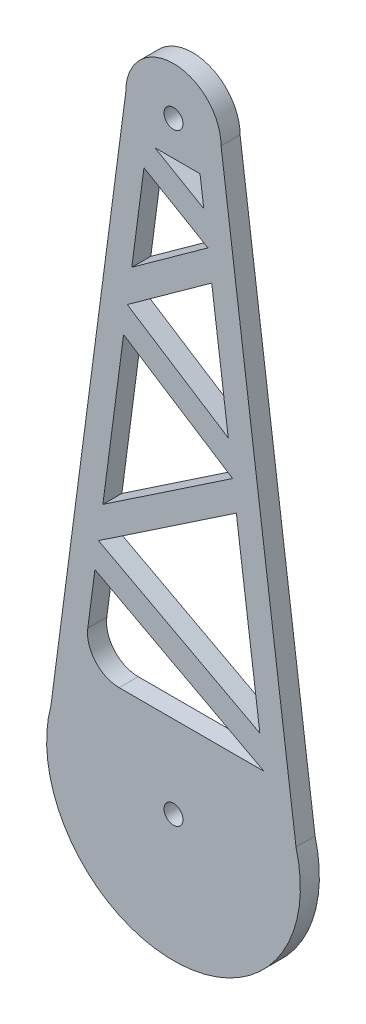
ISO-10303-21;
HEADER;
FILE_DESCRIPTION(('STEP AP214'),'2;1');
FILE_NAME('part.step','',(''),(''),'','','');
FILE_SCHEMA(('AUTOMOTIVE_DESIGN { 1 0 10303 214 1 1 1 1 }'));
ENDSEC;
DATA;
#1=APPLICATION_CONTEXT('core data for automotive mechanical design processes');
#2=APPLICATION_PROTOCOL_DEFINITION('international standard','automotive_design',2000,#1);
#3=PRODUCT_CONTEXT('',#1,'mechanical');
#4=PRODUCT('Part','Part','',(#3));
#5=PRODUCT_RELATED_PRODUCT_CATEGORY('part','',(#4));
#6=PRODUCT_DEFINITION_FORMATION('','',#4);
#7=PRODUCT_DEFINITION_CONTEXT('part definition',#1,'design');
#8=PRODUCT_DEFINITION('design','',#6,#7);
#9=PRODUCT_DEFINITION_SHAPE('','',#8);
#10=(LENGTH_UNIT() NAMED_UNIT(*) SI_UNIT(.MILLI.,.METRE.));
#11=(NAMED_UNIT(*) PLANE_ANGLE_UNIT() SI_UNIT($,.RADIAN.));
#12=(NAMED_UNIT(*) SI_UNIT($,.STERADIAN.) SOLID_ANGLE_UNIT());
#13=UNCERTAINTY_MEASURE_WITH_UNIT(LENGTH_MEASURE(1.E-05),#10,'distance_accuracy_value','');
#14=(GEOMETRIC_REPRESENTATION_CONTEXT(3) GLOBAL_UNCERTAINTY_ASSIGNED_CONTEXT((#13)) GLOBAL_UNIT_ASSIGNED_CONTEXT((#10,
#11,#12)) REPRESENTATION_CONTEXT('',''));
#15=CARTESIAN_POINT('',(0.,0.,0.));
#16=DIRECTION('',(0.,0.,1.));
#17=DIRECTION('',(1.,0.,0.));
#18=AXIS2_PLACEMENT_3D('',#15,#16,#17);
#19=CARTESIAN_POINT('',(0.,0.,3.));
#20=DIRECTION('',(0.,0.,1.));
#21=DIRECTION('',(1.,0.,0.));
#22=AXIS2_PLACEMENT_3D('',#19,#20,#21);
#23=PLANE('',#22);
#24=CARTESIAN_POINT('',(0.,95.,3.));
#25=DIRECTION('',(0.,0.,1.));
#26=DIRECTION('',(1.,0.,0.));
#27=AXIS2_PLACEMENT_3D('',#24,#25,#26);
#28=CIRCLE('',#27,1.5);
#29=CARTESIAN_POINT('',(1.5,95.,3.));
#30=VERTEX_POINT('',#29);
#31=EDGE_CURVE('E346',#30,#30,#28,.T.);
#32=ORIENTED_EDGE('',*,*,#31,.F.);
#33=EDGE_LOOP('',(#32));
#34=FACE_BOUND('',#33,.T.);
#35=CARTESIAN_POINT('',(0.,0.,3.));
#36=DIRECTION('',(0.,0.,1.));
#37=DIRECTION('',(1.,0.,0.));
#38=AXIS2_PLACEMENT_3D('',#35,#36,#37);
#39=CIRCLE('',#38,20.);
#40=CARTESIAN_POINT('',(-19.3192648059905,5.17358747447242,3.));
#41=VERTEX_POINT('',#40);
#42=CARTESIAN_POINT('',(19.3192648059905,5.17358747447242,3.));
#43=VERTEX_POINT('',#42);
#44=EDGE_CURVE('E352',#41,#43,#39,.T.);
#45=ORIENTED_EDGE('',*,*,#44,.T.);
#46=DIRECTION('',(-0.130454512571387,0.991454295542544,0.));
#47=VECTOR('',#46,1.);
#48=CARTESIAN_POINT('',(19.3192648059905,5.17358747447242,3.));
#49=LINE('',#48,#47);
#50=CARTESIAN_POINT('',(7.5,95.,3.));
#51=VERTEX_POINT('',#50);
#52=EDGE_CURVE('E355',#43,#51,#49,.T.);
#53=ORIENTED_EDGE('',*,*,#52,.T.);
#54=CARTESIAN_POINT('',(0.,95.,3.));
#55=DIRECTION('',(0.,0.,1.));
#56=DIRECTION('',(1.,0.,0.));
#57=AXIS2_PLACEMENT_3D('',#54,#55,#56);
#58=CIRCLE('',#57,7.5);
#59=CARTESIAN_POINT('',(-7.5,95.,3.));
#60=VERTEX_POINT('',#59);
#61=EDGE_CURVE('E358',#51,#60,#58,.T.);
#62=ORIENTED_EDGE('',*,*,#61,.T.);
#63=DIRECTION('',(-0.130454512571387,-0.991454295542544,0.));
#64=VECTOR('',#63,1.);
#65=CARTESIAN_POINT('',(-19.3192648059905,5.17358747447242,3.));
#66=LINE('',#65,#64);
#67=EDGE_CURVE('E360',#60,#41,#66,.T.);
#68=ORIENTED_EDGE('',*,*,#67,.T.);
#69=EDGE_LOOP('',(#45,#53,#62,#68));
#70=FACE_BOUND('',#69,.T.);
#71=CARTESIAN_POINT('',(0.,0.,3.));
#72=DIRECTION('',(0.,0.,1.));
#73=DIRECTION('',(1.,0.,0.));
#74=AXIS2_PLACEMENT_3D('',#71,#72,#73);
#75=CIRCLE('',#74,1.5);
#76=CARTESIAN_POINT('',(1.5,0.,3.));
#77=VERTEX_POINT('',#76);
#78=EDGE_CURVE('E340',#77,#77,#75,.T.);
#79=ORIENTED_EDGE('',*,*,#78,.F.);
#80=EDGE_LOOP('',(#79));
#81=FACE_BOUND('',#80,.T.);
#82=DIRECTION('',(1.,0.,0.));
#83=VECTOR('',#82,1.);
#84=CARTESIAN_POINT('',(-14.2549962322659,13.,3.));
#85=LINE('',#84,#83);
#86=CARTESIAN_POINT('',(-8.55400468049309,13.,3.));
#87=VERTEX_POINT('',#86);
#88=CARTESIAN_POINT('',(14.2549962322659,13.,3.));
#89=VERTEX_POINT('',#88);
#90=EDGE_CURVE('E323',#87,#89,#85,.T.);
#91=ORIENTED_EDGE('',*,*,#90,.F.);
#92=CARTESIAN_POINT('',(-8.55400468049309,18.,3.));
#93=DIRECTION('',(0.,0.,1.));
#94=DIRECTION('',(1.,0.,0.));
#95=AXIS2_PLACEMENT_3D('',#92,#93,#94);
#96=CIRCLE('',#95,5.);
#97=CARTESIAN_POINT('',(-13.5112761582058,18.6522725628569,3.));
#98=VERTEX_POINT('',#97);
#99=EDGE_CURVE('E11',#87,#98,#96,.F.);
#100=ORIENTED_EDGE('',*,*,#99,.T.);
#101=DIRECTION('',(-0.130454512571387,-0.991454295542544,0.));
#102=VECTOR('',#101,1.);
#103=CARTESIAN_POINT('',(-14.2549962322659,13.,3.));
#104=LINE('',#103,#102);
#105=CARTESIAN_POINT('',(-12.3855612897754,27.2077055629279,3.));
#106=VERTEX_POINT('',#105);
#107=EDGE_CURVE('E320',#106,#98,#104,.T.);
#108=ORIENTED_EDGE('',*,*,#107,.F.);
#109=DIRECTION('',(-0.882361079618329,0.470572975397842,0.));
#110=VECTOR('',#109,1.);
#111=CARTESIAN_POINT('',(-12.3855612897754,27.2077055629279,3.));
#112=LINE('',#111,#110);
#113=EDGE_CURVE('E326',#89,#106,#112,.T.);
#114=ORIENTED_EDGE('',*,*,#113,.F.);
#115=EDGE_LOOP('',(#91,#100,#108,#114));
#116=FACE_BOUND('',#115,.T.);
#117=DIRECTION('',(-1.,0.,0.));
#118=VECTOR('',#117,1.);
#119=CARTESIAN_POINT('',(-2.8983293994928,89.5344183994068,3.));
#120=LINE('',#119,#118);
#121=CARTESIAN_POINT('',(4.18467802181767,89.5344183994068,3.));
#122=VERTEX_POINT('',#121);
#123=CARTESIAN_POINT('',(-2.8983293994928,89.5344183994068,3.));
#124=VERTEX_POINT('',#123);
#125=EDGE_CURVE('E298',#122,#124,#120,.T.);
#126=ORIENTED_EDGE('',*,*,#125,.F.);
#127=DIRECTION('',(-0.130454512571387,0.991454295542544,0.));
#128=VECTOR('',#127,1.);
#129=CARTESIAN_POINT('',(4.18467802181767,89.5344183994068,3.));
#130=LINE('',#129,#128);
#131=CARTESIAN_POINT('',(4.77424214587069,85.0537310566038,3.));
#132=VERTEX_POINT('',#131);
#133=EDGE_CURVE('E296',#132,#122,#130,.T.);
#134=ORIENTED_EDGE('',*,*,#133,.F.);
#135=DIRECTION('',(0.863532865345183,-0.504292564359953,0.));
#136=VECTOR('',#135,1.);
#137=CARTESIAN_POINT('',(4.77424214587069,85.0537310566038,3.));
#138=LINE('',#137,#136);
#139=EDGE_CURVE('E302',#124,#132,#138,.T.);
#140=ORIENTED_EDGE('',*,*,#139,.F.);
#141=EDGE_LOOP('',(#126,#134,#140));
#142=FACE_BOUND('',#141,.T.);
#143=DIRECTION('',(0.882361079618329,-0.470572975397842,0.));
#144=VECTOR('',#143,1.);
#145=CARTESIAN_POINT('',(-11.8281878592665,31.4437436347958,3.));
#146=LINE('',#145,#144);
#147=CARTESIAN_POINT('',(-11.8281878592665,31.4437436347958,3.));
#148=VERTEX_POINT('',#147);
#149=CARTESIAN_POINT('',(13.6134947317704,17.8754114037659,3.));
#150=VERTEX_POINT('',#149);
#151=EDGE_CURVE('E274',#148,#150,#146,.T.);
#152=ORIENTED_EDGE('',*,*,#151,.F.);
#153=DIRECTION('',(-0.829674359833625,-0.558247666036021,0.));
#154=VECTOR('',#153,1.);
#155=CARTESIAN_POINT('',(-11.8281878592665,31.4437436347958,3.));
#156=LINE('',#155,#154);
#157=CARTESIAN_POINT('',(9.90415614739839,46.0663846449933,3.));
#158=VERTEX_POINT('',#157);
#159=EDGE_CURVE('E272',#158,#148,#156,.T.);
#160=ORIENTED_EDGE('',*,*,#159,.F.);
#161=DIRECTION('',(-0.130454512571388,0.991454295542544,0.));
#162=VECTOR('',#161,1.);
#163=CARTESIAN_POINT('',(9.90415614739839,46.0663846449933,3.));
#164=LINE('',#163,#162);
#165=EDGE_CURVE('E278',#150,#158,#164,.T.);
#166=ORIENTED_EDGE('',*,*,#165,.F.);
#167=EDGE_LOOP('',(#152,#160,#166));
#168=FACE_BOUND('',#167,.T.);
#169=DIRECTION('',(-0.841016420524364,0.541009593638029,0.));
#170=VECTOR('',#169,1.);
#171=CARTESIAN_POINT('',(9.32138627489469,50.4954356760215,3.));
#172=LINE('',#171,#170);
#173=CARTESIAN_POINT('',(9.32138627489469,50.4954356760215,3.));
#174=VERTEX_POINT('',#173);
#175=CARTESIAN_POINT('',(-7.86656077104383,61.552109505288,3.));
#176=VERTEX_POINT('',#175);
#177=EDGE_CURVE('E250',#174,#176,#172,.T.);
#178=ORIENTED_EDGE('',*,*,#177,.F.);
#179=DIRECTION('',(0.829674359833625,0.558247666036021,0.));
#180=VECTOR('',#179,1.);
#181=CARTESIAN_POINT('',(-11.1322061493552,36.7332046301214,3.));
#182=LINE('',#181,#180);
#183=CARTESIAN_POINT('',(-11.1322061493552,36.7332046301214,3.));
#184=VERTEX_POINT('',#183);
#185=EDGE_CURVE('E248',#184,#174,#182,.T.);
#186=ORIENTED_EDGE('',*,*,#185,.F.);
#187=DIRECTION('',(-0.130454512571387,-0.991454295542544,0.));
#188=VECTOR('',#187,1.);
#189=CARTESIAN_POINT('',(-11.1322061493552,36.7332046301214,3.));
#190=LINE('',#189,#188);
#191=EDGE_CURVE('E254',#176,#184,#190,.T.);
#192=ORIENTED_EDGE('',*,*,#191,.F.);
#193=EDGE_LOOP('',(#178,#186,#192));
#194=FACE_BOUND('',#193,.T.);
#195=DIRECTION('',(0.841016420524364,-0.54100959363803,0.));
#196=VECTOR('',#195,1.);
#197=CARTESIAN_POINT('',(-7.2895878516735,65.9371036925025,3.));
#198=LINE('',#197,#196);
#199=CARTESIAN_POINT('',(-7.2895878516735,65.9371036925025,3.));
#200=VERTEX_POINT('',#199);
#201=CARTESIAN_POINT('',(8.63770917531629,55.6913816328174,3.));
#202=VERTEX_POINT('',#201);
#203=EDGE_CURVE('E226',#200,#202,#198,.T.);
#204=ORIENTED_EDGE('',*,*,#203,.F.);
#205=DIRECTION('',(-0.811312634400087,-0.584612529170211,0.));
#206=VECTOR('',#205,1.);
#207=CARTESIAN_POINT('',(-7.2895878516735,65.9371036925025,3.));
#208=LINE('',#207,#206);
#209=CARTESIAN_POINT('',(6.02700626826781,75.5327237263858,3.));
#210=VERTEX_POINT('',#209);
#211=EDGE_CURVE('E224',#210,#200,#208,.T.);
#212=ORIENTED_EDGE('',*,*,#211,.F.);
#213=DIRECTION('',(-0.130454512571388,0.991454295542544,0.));
#214=VECTOR('',#213,1.);
#215=CARTESIAN_POINT('',(6.02700626826781,75.5327237263858,3.));
#216=LINE('',#215,#214);
#217=EDGE_CURVE('E230',#202,#210,#216,.T.);
#218=ORIENTED_EDGE('',*,*,#217,.F.);
#219=EDGE_LOOP('',(#204,#212,#218));
#220=FACE_BOUND('',#219,.T.);
#221=DIRECTION('',(0.811312634400087,0.584612529170212,0.));
#222=VECTOR('',#221,1.);
#223=CARTESIAN_POINT('',(-6.57291709451182,71.3838014469313,3.));
#224=LINE('',#223,#222);
#225=CARTESIAN_POINT('',(-6.57291709451182,71.3838014469313,3.));
#226=VERTEX_POINT('',#225);
#227=CARTESIAN_POINT('',(5.43446534090851,80.0360347743164,3.));
#228=VERTEX_POINT('',#227);
#229=EDGE_CURVE('E202',#226,#228,#224,.T.);
#230=ORIENTED_EDGE('',*,*,#229,.F.);
#231=DIRECTION('',(-0.130454512571387,-0.991454295542544,0.));
#232=VECTOR('',#231,1.);
#233=CARTESIAN_POINT('',(-6.57291709451182,71.3838014469313,3.));
#234=LINE('',#233,#232);
#235=CARTESIAN_POINT('',(-4.65888722730547,85.9304284376996,3.));
#236=VERTEX_POINT('',#235);
#237=EDGE_CURVE('E192',#236,#226,#234,.T.);
#238=ORIENTED_EDGE('',*,*,#237,.F.);
#239=DIRECTION('',(-0.863532865345184,0.504292564359953,0.));
#240=VECTOR('',#239,1.);
#241=CARTESIAN_POINT('',(5.43446534090851,80.0360347743164,3.));
#242=LINE('',#241,#240);
#243=EDGE_CURVE('E213',#228,#236,#242,.T.);
#244=ORIENTED_EDGE('',*,*,#243,.F.);
#245=EDGE_LOOP('',(#230,#238,#244));
#246=FACE_BOUND('',#245,.T.);
#247=ADVANCED_FACE('F38',(#34,#70,#81,#116,#142,#168,#194,#220,#246),#23,.T.);
#248=CARTESIAN_POINT('',(0.,0.,0.));
#249=DIRECTION('',(0.,0.,1.));
#250=DIRECTION('',(1.,0.,0.));
#251=AXIS2_PLACEMENT_3D('',#248,#249,#250);
#252=PLANE('',#251);
#253=DIRECTION('',(-0.811312634400087,-0.584612529170211,0.));
#254=VECTOR('',#253,1.);
#255=CARTESIAN_POINT('',(-7.2895878516735,65.9371036925025,0.));
#256=LINE('',#255,#254);
#257=CARTESIAN_POINT('',(6.02700626826781,75.5327237263858,0.));
#258=VERTEX_POINT('',#257);
#259=CARTESIAN_POINT('',(-7.2895878516735,65.9371036925025,0.));
#260=VERTEX_POINT('',#259);
#261=EDGE_CURVE('E210',#258,#260,#256,.T.);
#262=ORIENTED_EDGE('',*,*,#261,.T.);
#263=DIRECTION('',(0.841016420524364,-0.54100959363803,0.));
#264=VECTOR('',#263,1.);
#265=CARTESIAN_POINT('',(-7.2895878516735,65.9371036925025,0.));
#266=LINE('',#265,#264);
#267=CARTESIAN_POINT('',(8.63770917531629,55.6913816328174,0.));
#268=VERTEX_POINT('',#267);
#269=EDGE_CURVE('E235',#260,#268,#266,.T.);
#270=ORIENTED_EDGE('',*,*,#269,.T.);
#271=DIRECTION('',(-0.130454512571388,0.991454295542544,0.));
#272=VECTOR('',#271,1.);
#273=CARTESIAN_POINT('',(6.02700626826781,75.5327237263858,0.));
#274=LINE('',#273,#272);
#275=EDGE_CURVE('E227',#268,#258,#274,.T.);
#276=ORIENTED_EDGE('',*,*,#275,.T.);
#277=EDGE_LOOP('',(#262,#270,#276));
#278=FACE_BOUND('',#277,.T.);
#279=DIRECTION('',(-0.829674359833625,-0.558247666036021,0.));
#280=VECTOR('',#279,1.);
#281=CARTESIAN_POINT('',(-11.8281878592665,31.4437436347958,0.));
#282=LINE('',#281,#280);
#283=CARTESIAN_POINT('',(9.90415614739839,46.0663846449933,0.));
#284=VERTEX_POINT('',#283);
#285=CARTESIAN_POINT('',(-11.8281878592665,31.4437436347958,0.));
#286=VERTEX_POINT('',#285);
#287=EDGE_CURVE('E271',#284,#286,#282,.T.);
#288=ORIENTED_EDGE('',*,*,#287,.T.);
#289=DIRECTION('',(0.882361079618329,-0.470572975397842,0.));
#290=VECTOR('',#289,1.);
#291=CARTESIAN_POINT('',(-11.8281878592665,31.4437436347958,0.));
#292=LINE('',#291,#290);
#293=CARTESIAN_POINT('',(13.6134947317704,17.8754114037659,0.));
#294=VERTEX_POINT('',#293);
#295=EDGE_CURVE('E283',#286,#294,#292,.T.);
#296=ORIENTED_EDGE('',*,*,#295,.T.);
#297=DIRECTION('',(-0.130454512571388,0.991454295542544,0.));
#298=VECTOR('',#297,1.);
#299=CARTESIAN_POINT('',(9.90415614739839,46.0663846449933,0.));
#300=LINE('',#299,#298);
#301=EDGE_CURVE('E275',#294,#284,#300,.T.);
#302=ORIENTED_EDGE('',*,*,#301,.T.);
#303=EDGE_LOOP('',(#288,#296,#302));
#304=FACE_BOUND('',#303,.T.);
#305=DIRECTION('',(-0.130454512571387,-0.991454295542544,0.));
#306=VECTOR('',#305,1.);
#307=CARTESIAN_POINT('',(-14.2549962322659,13.,0.));
#308=LINE('',#307,#306);
#309=CARTESIAN_POINT('',(-12.3855612897754,27.2077055629279,0.));
#310=VERTEX_POINT('',#309);
#311=CARTESIAN_POINT('',(-13.5112761582058,18.6522725628569,0.));
#312=VERTEX_POINT('',#311);
#313=EDGE_CURVE('E319',#310,#312,#308,.T.);
#314=ORIENTED_EDGE('',*,*,#313,.T.);
#315=CARTESIAN_POINT('',(-8.55400468049309,18.,0.));
#316=DIRECTION('',(0.,0.,1.));
#317=DIRECTION('',(1.,0.,0.));
#318=AXIS2_PLACEMENT_3D('',#315,#316,#317);
#319=CIRCLE('',#318,5.);
#320=CARTESIAN_POINT('',(-8.55400468049309,13.,0.));
#321=VERTEX_POINT('',#320);
#322=EDGE_CURVE('E46',#312,#321,#319,.T.);
#323=ORIENTED_EDGE('',*,*,#322,.T.);
#324=DIRECTION('',(1.,0.,0.));
#325=VECTOR('',#324,1.);
#326=CARTESIAN_POINT('',(-14.2549962322659,13.,0.));
#327=LINE('',#326,#325);
#328=CARTESIAN_POINT('',(14.2549962322659,13.,0.));
#329=VERTEX_POINT('',#328);
#330=EDGE_CURVE('E330',#321,#329,#327,.T.);
#331=ORIENTED_EDGE('',*,*,#330,.T.);
#332=DIRECTION('',(-0.882361079618329,0.470572975397842,0.));
#333=VECTOR('',#332,1.);
#334=CARTESIAN_POINT('',(-12.3855612897754,27.2077055629279,0.));
#335=LINE('',#334,#333);
#336=EDGE_CURVE('E324',#329,#310,#335,.T.);
#337=ORIENTED_EDGE('',*,*,#336,.T.);
#338=EDGE_LOOP('',(#314,#323,#331,#337));
#339=FACE_BOUND('',#338,.T.);
#340=CARTESIAN_POINT('',(0.,0.,0.));
#341=DIRECTION('',(0.,0.,1.));
#342=DIRECTION('',(1.,0.,0.));
#343=AXIS2_PLACEMENT_3D('',#340,#341,#342);
#344=CIRCLE('',#343,20.);
#345=CARTESIAN_POINT('',(-19.3192648059905,5.17358747447242,0.));
#346=VERTEX_POINT('',#345);
#347=CARTESIAN_POINT('',(19.3192648059905,5.17358747447242,0.));
#348=VERTEX_POINT('',#347);
#349=EDGE_CURVE('E349',#346,#348,#344,.T.);
#350=ORIENTED_EDGE('',*,*,#349,.F.);
#351=DIRECTION('',(-0.130454512571387,-0.991454295542544,0.));
#352=VECTOR('',#351,1.);
#353=CARTESIAN_POINT('',(-19.3192648059905,5.17358747447242,0.));
#354=LINE('',#353,#352);
#355=CARTESIAN_POINT('',(-7.5,95.,0.));
#356=VERTEX_POINT('',#355);
#357=EDGE_CURVE('E356',#356,#346,#354,.T.);
#358=ORIENTED_EDGE('',*,*,#357,.F.);
#359=CARTESIAN_POINT('',(0.,95.,0.));
#360=DIRECTION('',(0.,0.,1.));
#361=DIRECTION('',(1.,0.,0.));
#362=AXIS2_PLACEMENT_3D('',#359,#360,#361);
#363=CIRCLE('',#362,7.5);
#364=CARTESIAN_POINT('',(7.5,95.,0.));
#365=VERTEX_POINT('',#364);
#366=EDGE_CURVE('E367',#365,#356,#363,.T.);
#367=ORIENTED_EDGE('',*,*,#366,.F.);
#368=DIRECTION('',(-0.130454512571387,0.991454295542544,0.));
#369=VECTOR('',#368,1.);
#370=CARTESIAN_POINT('',(19.3192648059905,5.17358747447242,0.));
#371=LINE('',#370,#369);
#372=EDGE_CURVE('E365',#348,#365,#371,.T.);
#373=ORIENTED_EDGE('',*,*,#372,.F.);
#374=EDGE_LOOP('',(#350,#358,#367,#373));
#375=FACE_BOUND('',#374,.T.);
#376=CARTESIAN_POINT('',(0.,95.,0.));
#377=DIRECTION('',(0.,0.,1.));
#378=DIRECTION('',(1.,0.,0.));
#379=AXIS2_PLACEMENT_3D('',#376,#377,#378);
#380=CIRCLE('',#379,1.5);
#381=CARTESIAN_POINT('',(1.5,95.,0.));
#382=VERTEX_POINT('',#381);
#383=EDGE_CURVE('E343',#382,#382,#380,.T.);
#384=ORIENTED_EDGE('',*,*,#383,.T.);
#385=EDGE_LOOP('',(#384));
#386=FACE_BOUND('',#385,.T.);
#387=CARTESIAN_POINT('',(0.,0.,0.));
#388=DIRECTION('',(0.,0.,1.));
#389=DIRECTION('',(1.,0.,0.));
#390=AXIS2_PLACEMENT_3D('',#387,#388,#389);
#391=CIRCLE('',#390,1.5);
#392=CARTESIAN_POINT('',(1.5,0.,0.));
#393=VERTEX_POINT('',#392);
#394=EDGE_CURVE('E339',#393,#393,#391,.T.);
#395=ORIENTED_EDGE('',*,*,#394,.T.);
#396=EDGE_LOOP('',(#395));
#397=FACE_BOUND('',#396,.T.);
#398=DIRECTION('',(-0.130454512571387,0.991454295542544,0.));
#399=VECTOR('',#398,1.);
#400=CARTESIAN_POINT('',(4.18467802181767,89.5344183994068,0.));
#401=LINE('',#400,#399);
#402=CARTESIAN_POINT('',(4.77424214587069,85.0537310566039,0.));
#403=VERTEX_POINT('',#402);
#404=CARTESIAN_POINT('',(4.18467802181767,89.5344183994068,0.));
#405=VERTEX_POINT('',#404);
#406=EDGE_CURVE('E295',#403,#405,#401,.T.);
#407=ORIENTED_EDGE('',*,*,#406,.T.);
#408=DIRECTION('',(-1.,0.,0.));
#409=VECTOR('',#408,1.);
#410=CARTESIAN_POINT('',(-2.8983293994928,89.5344183994068,0.));
#411=LINE('',#410,#409);
#412=CARTESIAN_POINT('',(-2.8983293994928,89.5344183994068,0.));
#413=VERTEX_POINT('',#412);
#414=EDGE_CURVE('E307',#405,#413,#411,.T.);
#415=ORIENTED_EDGE('',*,*,#414,.T.);
#416=DIRECTION('',(0.863532865345183,-0.504292564359953,0.));
#417=VECTOR('',#416,1.);
#418=CARTESIAN_POINT('',(4.77424214587069,85.0537310566038,0.));
#419=LINE('',#418,#417);
#420=EDGE_CURVE('E299',#413,#403,#419,.T.);
#421=ORIENTED_EDGE('',*,*,#420,.T.);
#422=EDGE_LOOP('',(#407,#415,#421));
#423=FACE_BOUND('',#422,.T.);
#424=DIRECTION('',(0.829674359833625,0.558247666036021,0.));
#425=VECTOR('',#424,1.);
#426=CARTESIAN_POINT('',(-11.1322061493552,36.7332046301214,0.));
#427=LINE('',#426,#425);
#428=CARTESIAN_POINT('',(-11.1322061493552,36.7332046301214,0.));
#429=VERTEX_POINT('',#428);
#430=CARTESIAN_POINT('',(9.32138627489469,50.4954356760215,0.));
#431=VERTEX_POINT('',#430);
#432=EDGE_CURVE('E247',#429,#431,#427,.T.);
#433=ORIENTED_EDGE('',*,*,#432,.T.);
#434=DIRECTION('',(-0.841016420524364,0.541009593638029,0.));
#435=VECTOR('',#434,1.);
#436=CARTESIAN_POINT('',(9.32138627489469,50.4954356760215,0.));
#437=LINE('',#436,#435);
#438=CARTESIAN_POINT('',(-7.86656077104383,61.552109505288,0.));
#439=VERTEX_POINT('',#438);
#440=EDGE_CURVE('E259',#431,#439,#437,.T.);
#441=ORIENTED_EDGE('',*,*,#440,.T.);
#442=DIRECTION('',(-0.130454512571387,-0.991454295542544,0.));
#443=VECTOR('',#442,1.);
#444=CARTESIAN_POINT('',(-11.1322061493552,36.7332046301214,0.));
#445=LINE('',#444,#443);
#446=EDGE_CURVE('E251',#439,#429,#445,.T.);
#447=ORIENTED_EDGE('',*,*,#446,.T.);
#448=EDGE_LOOP('',(#433,#441,#447));
#449=FACE_BOUND('',#448,.T.);
#450=DIRECTION('',(-0.130454512571387,-0.991454295542544,0.));
#451=VECTOR('',#450,1.);
#452=CARTESIAN_POINT('',(-6.57291709451182,71.3838014469313,0.));
#453=LINE('',#452,#451);
#454=CARTESIAN_POINT('',(-4.65888722730547,85.9304284376995,0.));
#455=VERTEX_POINT('',#454);
#456=CARTESIAN_POINT('',(-6.57291709451182,71.3838014469313,0.));
#457=VERTEX_POINT('',#456);
#458=EDGE_CURVE('E217',#455,#457,#453,.T.);
#459=ORIENTED_EDGE('',*,*,#458,.T.);
#460=DIRECTION('',(0.811312634400087,0.584612529170212,0.));
#461=VECTOR('',#460,1.);
#462=CARTESIAN_POINT('',(-6.57291709451182,71.3838014469313,0.));
#463=LINE('',#462,#461);
#464=CARTESIAN_POINT('',(5.43446534090851,80.0360347743164,0.));
#465=VERTEX_POINT('',#464);
#466=EDGE_CURVE('E209',#457,#465,#463,.T.);
#467=ORIENTED_EDGE('',*,*,#466,.T.);
#468=DIRECTION('',(-0.863532865345184,0.504292564359953,0.));
#469=VECTOR('',#468,1.);
#470=CARTESIAN_POINT('',(5.43446534090851,80.0360347743164,0.));
#471=LINE('',#470,#469);
#472=EDGE_CURVE('E203',#465,#455,#471,.T.);
#473=ORIENTED_EDGE('',*,*,#472,.T.);
#474=EDGE_LOOP('',(#459,#467,#473));
#475=FACE_BOUND('',#474,.T.);
#476=ADVANCED_FACE('F391',(#278,#304,#339,#375,#386,#397,#423,#449,#475),#252,.F.);
#477=CARTESIAN_POINT('',(0.,0.,3.));
#478=DIRECTION('',(0.,0.,-1.));
#479=DIRECTION('',(-1.,0.,0.));
#480=AXIS2_PLACEMENT_3D('',#477,#478,#479);
#481=CYLINDRICAL_SURFACE('',#480,20.);
#482=ORIENTED_EDGE('',*,*,#349,.T.);
#483=DIRECTION('',(0.,0.,-1.));
#484=VECTOR('',#483,1.);
#485=CARTESIAN_POINT('',(19.3192648059905,5.17358747447242,3.));
#486=LINE('',#485,#484);
#487=EDGE_CURVE('E378',#43,#348,#486,.T.);
#488=ORIENTED_EDGE('',*,*,#487,.F.);
#489=ORIENTED_EDGE('',*,*,#44,.F.);
#490=DIRECTION('',(0.,0.,-1.));
#491=VECTOR('',#490,1.);
#492=CARTESIAN_POINT('',(-19.3192648059905,5.17358747447242,3.));
#493=LINE('',#492,#491);
#494=EDGE_CURVE('E362',#41,#346,#493,.T.);
#495=ORIENTED_EDGE('',*,*,#494,.T.);
#496=EDGE_LOOP('',(#482,#488,#489,#495));
#497=FACE_BOUND('',#496,.T.);
#498=ADVANCED_FACE('F414',(#497),#481,.T.);
#499=CARTESIAN_POINT('',(19.3192648059905,5.17358747447242,3.));
#500=DIRECTION('',(-0.991454295542544,-0.130454512571387,0.));
#501=DIRECTION('',(0.130454512571387,-0.991454295542544,0.));
#502=AXIS2_PLACEMENT_3D('',#499,#500,#501);
#503=PLANE('',#502);
#504=ORIENTED_EDGE('',*,*,#372,.T.);
#505=DIRECTION('',(0.,0.,-1.));
#506=VECTOR('',#505,1.);
#507=CARTESIAN_POINT('',(7.5,95.,3.));
#508=LINE('',#507,#506);
#509=EDGE_CURVE('E375',#51,#365,#508,.T.);
#510=ORIENTED_EDGE('',*,*,#509,.F.);
#511=ORIENTED_EDGE('',*,*,#52,.F.);
#512=ORIENTED_EDGE('',*,*,#487,.T.);
#513=EDGE_LOOP('',(#504,#510,#511,#512));
#514=FACE_BOUND('',#513,.T.);
#515=ADVANCED_FACE('F430',(#514),#503,.F.);
#516=CARTESIAN_POINT('',(0.,95.,3.));
#517=DIRECTION('',(0.,0.,-1.));
#518=DIRECTION('',(-1.,0.,0.));
#519=AXIS2_PLACEMENT_3D('',#516,#517,#518);
#520=CYLINDRICAL_SURFACE('',#519,7.5);
#521=ORIENTED_EDGE('',*,*,#366,.T.);
#522=DIRECTION('',(0.,0.,-1.));
#523=VECTOR('',#522,1.);
#524=CARTESIAN_POINT('',(-7.5,95.,3.));
#525=LINE('',#524,#523);
#526=EDGE_CURVE('E372',#60,#356,#525,.T.);
#527=ORIENTED_EDGE('',*,*,#526,.F.);
#528=ORIENTED_EDGE('',*,*,#61,.F.);
#529=ORIENTED_EDGE('',*,*,#509,.T.);
#530=EDGE_LOOP('',(#521,#527,#528,#529));
#531=FACE_BOUND('',#530,.T.);
#532=ADVANCED_FACE('F426',(#531),#520,.T.);
#533=CARTESIAN_POINT('',(-19.3192648059905,5.17358747447242,3.));
#534=DIRECTION('',(0.991454295542544,-0.130454512571387,0.));
#535=DIRECTION('',(0.130454512571387,0.991454295542544,0.));
#536=AXIS2_PLACEMENT_3D('',#533,#534,#535);
#537=PLANE('',#536);
#538=ORIENTED_EDGE('',*,*,#357,.T.);
#539=ORIENTED_EDGE('',*,*,#494,.F.);
#540=ORIENTED_EDGE('',*,*,#67,.F.);
#541=ORIENTED_EDGE('',*,*,#526,.T.);
#542=EDGE_LOOP('',(#538,#539,#540,#541));
#543=FACE_BOUND('',#542,.T.);
#544=ADVANCED_FACE('F423',(#543),#537,.F.);
#545=CARTESIAN_POINT('',(0.,95.,3.));
#546=DIRECTION('',(0.,0.,-1.));
#547=DIRECTION('',(-1.,0.,0.));
#548=AXIS2_PLACEMENT_3D('',#545,#546,#547);
#549=CYLINDRICAL_SURFACE('',#548,1.5);
#550=ORIENTED_EDGE('',*,*,#31,.T.);
#551=EDGE_LOOP('',(#550));
#552=FACE_BOUND('',#551,.T.);
#553=ORIENTED_EDGE('',*,*,#383,.F.);
#554=EDGE_LOOP('',(#553));
#555=FACE_BOUND('',#554,.T.);
#556=ADVANCED_FACE('F420',(#552,#555),#549,.F.);
#557=CARTESIAN_POINT('',(0.,0.,3.));
#558=DIRECTION('',(0.,0.,-1.));
#559=DIRECTION('',(-1.,0.,0.));
#560=AXIS2_PLACEMENT_3D('',#557,#558,#559);
#561=CYLINDRICAL_SURFACE('',#560,1.5);
#562=ORIENTED_EDGE('',*,*,#78,.T.);
#563=EDGE_LOOP('',(#562));
#564=FACE_BOUND('',#563,.T.);
#565=ORIENTED_EDGE('',*,*,#394,.F.);
#566=EDGE_LOOP('',(#565));
#567=FACE_BOUND('',#566,.T.);
#568=ADVANCED_FACE('F453',(#564,#567),#561,.F.);
#569=CARTESIAN_POINT('',(-14.2549962322659,13.,3.));
#570=DIRECTION('',(0.991454295542544,-0.130454512571387,0.));
#571=DIRECTION('',(0.130454512571387,0.991454295542544,0.));
#572=AXIS2_PLACEMENT_3D('',#569,#570,#571);
#573=PLANE('',#572);
#574=ORIENTED_EDGE('',*,*,#107,.T.);
#575=DIRECTION('',(0.,0.,-1.));
#576=VECTOR('',#575,1.);
#577=CARTESIAN_POINT('',(-13.5112761582058,18.6522725628569,0.));
#578=LINE('',#577,#576);
#579=EDGE_CURVE('E381',#98,#312,#578,.T.);
#580=ORIENTED_EDGE('',*,*,#579,.T.);
#581=ORIENTED_EDGE('',*,*,#313,.F.);
#582=DIRECTION('',(0.,0.,-1.));
#583=VECTOR('',#582,1.);
#584=CARTESIAN_POINT('',(-12.3855612897754,27.2077055629279,3.));
#585=LINE('',#584,#583);
#586=EDGE_CURVE('E328',#106,#310,#585,.T.);
#587=ORIENTED_EDGE('',*,*,#586,.F.);
#588=EDGE_LOOP('',(#574,#580,#581,#587));
#589=FACE_BOUND('',#588,.T.);
#590=ADVANCED_FACE('F386',(#589),#573,.T.);
#591=CARTESIAN_POINT('',(-14.2549962322659,13.,3.));
#592=DIRECTION('',(0.,1.,0.));
#593=DIRECTION('',(0.,0.,1.));
#594=AXIS2_PLACEMENT_3D('',#591,#592,#593);
#595=PLANE('',#594);
#596=ORIENTED_EDGE('',*,*,#330,.F.);
#597=DIRECTION('',(0.,0.,-1.));
#598=VECTOR('',#597,1.);
#599=CARTESIAN_POINT('',(-8.55400468049309,13.,3.));
#600=LINE('',#599,#598);
#601=EDGE_CURVE('E53',#321,#87,#600,.F.);
#602=ORIENTED_EDGE('',*,*,#601,.T.);
#603=ORIENTED_EDGE('',*,*,#90,.T.);
#604=DIRECTION('',(0.,0.,-1.));
#605=VECTOR('',#604,1.);
#606=CARTESIAN_POINT('',(14.2549962322659,13.,3.));
#607=LINE('',#606,#605);
#608=EDGE_CURVE('E336',#89,#329,#607,.T.);
#609=ORIENTED_EDGE('',*,*,#608,.T.);
#610=EDGE_LOOP('',(#596,#602,#603,#609));
#611=FACE_BOUND('',#610,.T.);
#612=ADVANCED_FACE('F513',(#611),#595,.T.);
#613=CARTESIAN_POINT('',(-12.3855612897754,27.2077055629279,3.));
#614=DIRECTION('',(-0.470572975397842,-0.882361079618328,0.));
#615=DIRECTION('',(0.882361079618328,-0.470572975397842,0.));
#616=AXIS2_PLACEMENT_3D('',#613,#614,#615);
#617=PLANE('',#616);
#618=ORIENTED_EDGE('',*,*,#336,.F.);
#619=ORIENTED_EDGE('',*,*,#608,.F.);
#620=ORIENTED_EDGE('',*,*,#113,.T.);
#621=ORIENTED_EDGE('',*,*,#586,.T.);
#622=EDGE_LOOP('',(#618,#619,#620,#621));
#623=FACE_BOUND('',#622,.T.);
#624=ADVANCED_FACE('F396',(#623),#617,.T.);
#625=CARTESIAN_POINT('',(4.18467802181767,89.5344183994068,3.));
#626=DIRECTION('',(-0.991454295542544,-0.130454512571387,0.));
#627=DIRECTION('',(0.130454512571387,-0.991454295542544,0.));
#628=AXIS2_PLACEMENT_3D('',#625,#626,#627);
#629=PLANE('',#628);
#630=ORIENTED_EDGE('',*,*,#406,.F.);
#631=DIRECTION('',(0.,0.,-1.));
#632=VECTOR('',#631,1.);
#633=CARTESIAN_POINT('',(4.77424214587069,85.0537310566038,3.));
#634=LINE('',#633,#632);
#635=EDGE_CURVE('E304',#132,#403,#634,.T.);
#636=ORIENTED_EDGE('',*,*,#635,.F.);
#637=ORIENTED_EDGE('',*,*,#133,.T.);
#638=DIRECTION('',(0.,0.,-1.));
#639=VECTOR('',#638,1.);
#640=CARTESIAN_POINT('',(4.18467802181767,89.5344183994068,3.));
#641=LINE('',#640,#639);
#642=EDGE_CURVE('E316',#122,#405,#641,.T.);
#643=ORIENTED_EDGE('',*,*,#642,.T.);
#644=EDGE_LOOP('',(#630,#636,#637,#643));
#645=FACE_BOUND('',#644,.T.);
#646=ADVANCED_FACE('F506',(#645),#629,.T.);
#647=CARTESIAN_POINT('',(-2.8983293994928,89.5344183994068,3.));
#648=DIRECTION('',(0.,-1.,0.));
#649=DIRECTION('',(1.,0.,0.));
#650=AXIS2_PLACEMENT_3D('',#647,#648,#649);
#651=PLANE('',#650);
#652=ORIENTED_EDGE('',*,*,#414,.F.);
#653=ORIENTED_EDGE('',*,*,#642,.F.);
#654=ORIENTED_EDGE('',*,*,#125,.T.);
#655=DIRECTION('',(0.,0.,-1.));
#656=VECTOR('',#655,1.);
#657=CARTESIAN_POINT('',(-2.8983293994928,89.5344183994068,3.));
#658=LINE('',#657,#656);
#659=EDGE_CURVE('E314',#124,#413,#658,.T.);
#660=ORIENTED_EDGE('',*,*,#659,.T.);
#661=EDGE_LOOP('',(#652,#653,#654,#660));
#662=FACE_BOUND('',#661,.T.);
#663=ADVANCED_FACE('F502',(#662),#651,.T.);
#664=CARTESIAN_POINT('',(4.77424214587069,85.0537310566038,3.));
#665=DIRECTION('',(0.504292564359953,0.863532865345183,0.));
#666=DIRECTION('',(-0.863532865345184,0.504292564359953,0.));
#667=AXIS2_PLACEMENT_3D('',#664,#665,#666);
#668=PLANE('',#667);
#669=ORIENTED_EDGE('',*,*,#420,.F.);
#670=ORIENTED_EDGE('',*,*,#659,.F.);
#671=ORIENTED_EDGE('',*,*,#139,.T.);
#672=ORIENTED_EDGE('',*,*,#635,.T.);
#673=EDGE_LOOP('',(#669,#670,#671,#672));
#674=FACE_BOUND('',#673,.T.);
#675=ADVANCED_FACE('F498',(#674),#668,.T.);
#676=CARTESIAN_POINT('',(-11.8281878592665,31.4437436347958,3.));
#677=DIRECTION('',(0.558247666036021,-0.829674359833625,0.));
#678=DIRECTION('',(0.829674359833625,0.558247666036021,0.));
#679=AXIS2_PLACEMENT_3D('',#676,#677,#678);
#680=PLANE('',#679);
#681=ORIENTED_EDGE('',*,*,#287,.F.);
#682=DIRECTION('',(0.,0.,-1.));
#683=VECTOR('',#682,1.);
#684=CARTESIAN_POINT('',(9.90415614739839,46.0663846449933,3.));
#685=LINE('',#684,#683);
#686=EDGE_CURVE('E280',#158,#284,#685,.T.);
#687=ORIENTED_EDGE('',*,*,#686,.F.);
#688=ORIENTED_EDGE('',*,*,#159,.T.);
#689=DIRECTION('',(0.,0.,-1.));
#690=VECTOR('',#689,1.);
#691=CARTESIAN_POINT('',(-11.8281878592665,31.4437436347958,3.));
#692=LINE('',#691,#690);
#693=EDGE_CURVE('E292',#148,#286,#692,.T.);
#694=ORIENTED_EDGE('',*,*,#693,.T.);
#695=EDGE_LOOP('',(#681,#687,#688,#694));
#696=FACE_BOUND('',#695,.T.);
#697=ADVANCED_FACE('F494',(#696),#680,.T.);
#698=CARTESIAN_POINT('',(-11.8281878592665,31.4437436347958,3.));
#699=DIRECTION('',(0.470572975397842,0.882361079618328,0.));
#700=DIRECTION('',(-0.882361079618329,0.470572975397842,0.));
#701=AXIS2_PLACEMENT_3D('',#698,#699,#700);
#702=PLANE('',#701);
#703=ORIENTED_EDGE('',*,*,#295,.F.);
#704=ORIENTED_EDGE('',*,*,#693,.F.);
#705=ORIENTED_EDGE('',*,*,#151,.T.);
#706=DIRECTION('',(0.,0.,-1.));
#707=VECTOR('',#706,1.);
#708=CARTESIAN_POINT('',(13.6134947317704,17.8754114037659,3.));
#709=LINE('',#708,#707);
#710=EDGE_CURVE('E290',#150,#294,#709,.T.);
#711=ORIENTED_EDGE('',*,*,#710,.T.);
#712=EDGE_LOOP('',(#703,#704,#705,#711));
#713=FACE_BOUND('',#712,.T.);
#714=ADVANCED_FACE('F490',(#713),#702,.T.);
#715=CARTESIAN_POINT('',(9.90415614739839,46.0663846449933,3.));
#716=DIRECTION('',(-0.991454295542544,-0.130454512571388,0.));
#717=DIRECTION('',(0.130454512571388,-0.991454295542544,0.));
#718=AXIS2_PLACEMENT_3D('',#715,#716,#717);
#719=PLANE('',#718);
#720=ORIENTED_EDGE('',*,*,#301,.F.);
#721=ORIENTED_EDGE('',*,*,#710,.F.);
#722=ORIENTED_EDGE('',*,*,#165,.T.);
#723=ORIENTED_EDGE('',*,*,#686,.T.);
#724=EDGE_LOOP('',(#720,#721,#722,#723));
#725=FACE_BOUND('',#724,.T.);
#726=ADVANCED_FACE('F484',(#725),#719,.T.);
#727=CARTESIAN_POINT('',(-11.1322061493552,36.7332046301214,3.));
#728=DIRECTION('',(-0.558247666036021,0.829674359833625,0.));
#729=DIRECTION('',(-0.829674359833625,-0.558247666036021,0.));
#730=AXIS2_PLACEMENT_3D('',#727,#728,#729);
#731=PLANE('',#730);
#732=ORIENTED_EDGE('',*,*,#432,.F.);
#733=DIRECTION('',(0.,0.,-1.));
#734=VECTOR('',#733,1.);
#735=CARTESIAN_POINT('',(-11.1322061493552,36.7332046301214,3.));
#736=LINE('',#735,#734);
#737=EDGE_CURVE('E256',#184,#429,#736,.T.);
#738=ORIENTED_EDGE('',*,*,#737,.F.);
#739=ORIENTED_EDGE('',*,*,#185,.T.);
#740=DIRECTION('',(0.,0.,-1.));
#741=VECTOR('',#740,1.);
#742=CARTESIAN_POINT('',(9.32138627489469,50.4954356760215,3.));
#743=LINE('',#742,#741);
#744=EDGE_CURVE('E268',#174,#431,#743,.T.);
#745=ORIENTED_EDGE('',*,*,#744,.T.);
#746=EDGE_LOOP('',(#732,#738,#739,#745));
#747=FACE_BOUND('',#746,.T.);
#748=ADVANCED_FACE('F465',(#747),#731,.T.);
#749=CARTESIAN_POINT('',(9.32138627489469,50.4954356760215,3.));
#750=DIRECTION('',(-0.54100959363803,-0.841016420524364,0.));
#751=DIRECTION('',(0.841016420524364,-0.54100959363803,0.));
#752=AXIS2_PLACEMENT_3D('',#749,#750,#751);
#753=PLANE('',#752);
#754=ORIENTED_EDGE('',*,*,#440,.F.);
#755=ORIENTED_EDGE('',*,*,#744,.F.);
#756=ORIENTED_EDGE('',*,*,#177,.T.);
#757=DIRECTION('',(0.,0.,-1.));
#758=VECTOR('',#757,1.);
#759=CARTESIAN_POINT('',(-7.86656077104383,61.552109505288,3.));
#760=LINE('',#759,#758);
#761=EDGE_CURVE('E266',#176,#439,#760,.T.);
#762=ORIENTED_EDGE('',*,*,#761,.T.);
#763=EDGE_LOOP('',(#754,#755,#756,#762));
#764=FACE_BOUND('',#763,.T.);
#765=ADVANCED_FACE('F475',(#764),#753,.T.);
#766=CARTESIAN_POINT('',(-11.1322061493552,36.7332046301214,3.));
#767=DIRECTION('',(0.991454295542544,-0.130454512571387,0.));
#768=DIRECTION('',(0.130454512571387,0.991454295542544,0.));
#769=AXIS2_PLACEMENT_3D('',#766,#767,#768);
#770=PLANE('',#769);
#771=ORIENTED_EDGE('',*,*,#446,.F.);
#772=ORIENTED_EDGE('',*,*,#761,.F.);
#773=ORIENTED_EDGE('',*,*,#191,.T.);
#774=ORIENTED_EDGE('',*,*,#737,.T.);
#775=EDGE_LOOP('',(#771,#772,#773,#774));
#776=FACE_BOUND('',#775,.T.);
#777=ADVANCED_FACE('F469',(#776),#770,.T.);
#778=CARTESIAN_POINT('',(-7.2895878516735,65.9371036925025,3.));
#779=DIRECTION('',(0.584612529170211,-0.811312634400087,0.));
#780=DIRECTION('',(0.811312634400087,0.584612529170211,0.));
#781=AXIS2_PLACEMENT_3D('',#778,#779,#780);
#782=PLANE('',#781);
#783=ORIENTED_EDGE('',*,*,#261,.F.);
#784=DIRECTION('',(0.,0.,-1.));
#785=VECTOR('',#784,1.);
#786=CARTESIAN_POINT('',(6.02700626826781,75.5327237263858,3.));
#787=LINE('',#786,#785);
#788=EDGE_CURVE('E232',#210,#258,#787,.T.);
#789=ORIENTED_EDGE('',*,*,#788,.F.);
#790=ORIENTED_EDGE('',*,*,#211,.T.);
#791=DIRECTION('',(0.,0.,-1.));
#792=VECTOR('',#791,1.);
#793=CARTESIAN_POINT('',(-7.2895878516735,65.9371036925025,3.));
#794=LINE('',#793,#792);
#795=EDGE_CURVE('E244',#200,#260,#794,.T.);
#796=ORIENTED_EDGE('',*,*,#795,.T.);
#797=EDGE_LOOP('',(#783,#789,#790,#796));
#798=FACE_BOUND('',#797,.T.);
#799=ADVANCED_FACE('F482',(#798),#782,.T.);
#800=CARTESIAN_POINT('',(-7.2895878516735,65.9371036925025,3.));
#801=DIRECTION('',(0.54100959363803,0.841016420524364,0.));
#802=DIRECTION('',(-0.841016420524364,0.54100959363803,0.));
#803=AXIS2_PLACEMENT_3D('',#800,#801,#802);
#804=PLANE('',#803);
#805=ORIENTED_EDGE('',*,*,#269,.F.);
#806=ORIENTED_EDGE('',*,*,#795,.F.);
#807=ORIENTED_EDGE('',*,*,#203,.T.);
#808=DIRECTION('',(0.,0.,-1.));
#809=VECTOR('',#808,1.);
#810=CARTESIAN_POINT('',(8.63770917531629,55.6913816328174,3.));
#811=LINE('',#810,#809);
#812=EDGE_CURVE('E242',#202,#268,#811,.T.);
#813=ORIENTED_EDGE('',*,*,#812,.T.);
#814=EDGE_LOOP('',(#805,#806,#807,#813));
#815=FACE_BOUND('',#814,.T.);
#816=ADVANCED_FACE('F555',(#815),#804,.T.);
#817=CARTESIAN_POINT('',(6.02700626826781,75.5327237263858,3.));
#818=DIRECTION('',(-0.991454295542544,-0.130454512571388,0.));
#819=DIRECTION('',(0.130454512571388,-0.991454295542544,0.));
#820=AXIS2_PLACEMENT_3D('',#817,#818,#819);
#821=PLANE('',#820);
#822=ORIENTED_EDGE('',*,*,#275,.F.);
#823=ORIENTED_EDGE('',*,*,#812,.F.);
#824=ORIENTED_EDGE('',*,*,#217,.T.);
#825=ORIENTED_EDGE('',*,*,#788,.T.);
#826=EDGE_LOOP('',(#822,#823,#824,#825));
#827=FACE_BOUND('',#826,.T.);
#828=ADVANCED_FACE('F547',(#827),#821,.T.);
#829=CARTESIAN_POINT('',(-6.57291709451182,71.3838014469313,3.));
#830=DIRECTION('',(0.991454295542544,-0.130454512571387,0.));
#831=DIRECTION('',(0.130454512571387,0.991454295542544,0.));
#832=AXIS2_PLACEMENT_3D('',#829,#830,#831);
#833=PLANE('',#832);
#834=ORIENTED_EDGE('',*,*,#458,.F.);
#835=DIRECTION('',(0.,0.,-1.));
#836=VECTOR('',#835,1.);
#837=CARTESIAN_POINT('',(-4.65888722730547,85.9304284376996,3.));
#838=LINE('',#837,#836);
#839=EDGE_CURVE('E198',#236,#455,#838,.T.);
#840=ORIENTED_EDGE('',*,*,#839,.F.);
#841=ORIENTED_EDGE('',*,*,#237,.T.);
#842=DIRECTION('',(0.,0.,-1.));
#843=VECTOR('',#842,1.);
#844=CARTESIAN_POINT('',(-6.57291709451182,71.3838014469313,3.));
#845=LINE('',#844,#843);
#846=EDGE_CURVE('E195',#226,#457,#845,.T.);
#847=ORIENTED_EDGE('',*,*,#846,.T.);
#848=EDGE_LOOP('',(#834,#840,#841,#847));
#849=FACE_BOUND('',#848,.T.);
#850=ADVANCED_FACE('F194',(#849),#833,.T.);
#851=CARTESIAN_POINT('',(-6.57291709451182,71.3838014469313,3.));
#852=DIRECTION('',(-0.584612529170211,0.811312634400086,0.));
#853=DIRECTION('',(-0.811312634400087,-0.584612529170212,0.));
#854=AXIS2_PLACEMENT_3D('',#851,#852,#853);
#855=PLANE('',#854);
#856=ORIENTED_EDGE('',*,*,#466,.F.);
#857=ORIENTED_EDGE('',*,*,#846,.F.);
#858=ORIENTED_EDGE('',*,*,#229,.T.);
#859=DIRECTION('',(0.,0.,-1.));
#860=VECTOR('',#859,1.);
#861=CARTESIAN_POINT('',(5.43446534090851,80.0360347743164,3.));
#862=LINE('',#861,#860);
#863=EDGE_CURVE('E211',#228,#465,#862,.T.);
#864=ORIENTED_EDGE('',*,*,#863,.T.);
#865=EDGE_LOOP('',(#856,#857,#858,#864));
#866=FACE_BOUND('',#865,.T.);
#867=ADVANCED_FACE('F207',(#866),#855,.T.);
#868=CARTESIAN_POINT('',(5.43446534090851,80.0360347743164,3.));
#869=DIRECTION('',(-0.504292564359953,-0.863532865345183,0.));
#870=DIRECTION('',(0.863532865345184,-0.504292564359953,0.));
#871=AXIS2_PLACEMENT_3D('',#868,#869,#870);
#872=PLANE('',#871);
#873=ORIENTED_EDGE('',*,*,#472,.F.);
#874=ORIENTED_EDGE('',*,*,#863,.F.);
#875=ORIENTED_EDGE('',*,*,#243,.T.);
#876=ORIENTED_EDGE('',*,*,#839,.T.);
#877=EDGE_LOOP('',(#873,#874,#875,#876));
#878=FACE_BOUND('',#877,.T.);
#879=ADVANCED_FACE('F401',(#878),#872,.T.);
#880=CARTESIAN_POINT('',(-8.55400468049309,18.,3.));
#881=DIRECTION('',(0.,0.,1.));
#882=DIRECTION('',(1.,0.,0.));
#883=AXIS2_PLACEMENT_3D('',#880,#881,#882);
#884=CYLINDRICAL_SURFACE('',#883,5.);
#885=ORIENTED_EDGE('',*,*,#99,.F.);
#886=ORIENTED_EDGE('',*,*,#601,.F.);
#887=ORIENTED_EDGE('',*,*,#322,.F.);
#888=ORIENTED_EDGE('',*,*,#579,.F.);
#889=EDGE_LOOP('',(#885,#886,#887,#888));
#890=FACE_BOUND('',#889,.T.);
#891=ADVANCED_FACE('F40',(#890),#884,.F.);
#892=CLOSED_SHELL('',(#247,#476,#498,#515,#532,#544,#556,#568,#590,#612,#624,#646,#663,#675,
#697,#714,#726,#748,#765,#777,#799,#816,#828,#850,#867,#879,#891));
#893=MANIFOLD_SOLID_BREP('B2',#892);
#894=ADVANCED_BREP_SHAPE_REPRESENTATION('',(#18,#893),#14);
#895=SHAPE_DEFINITION_REPRESENTATION(#9,#894);
ENDSEC;
END-ISO-10303-21;
